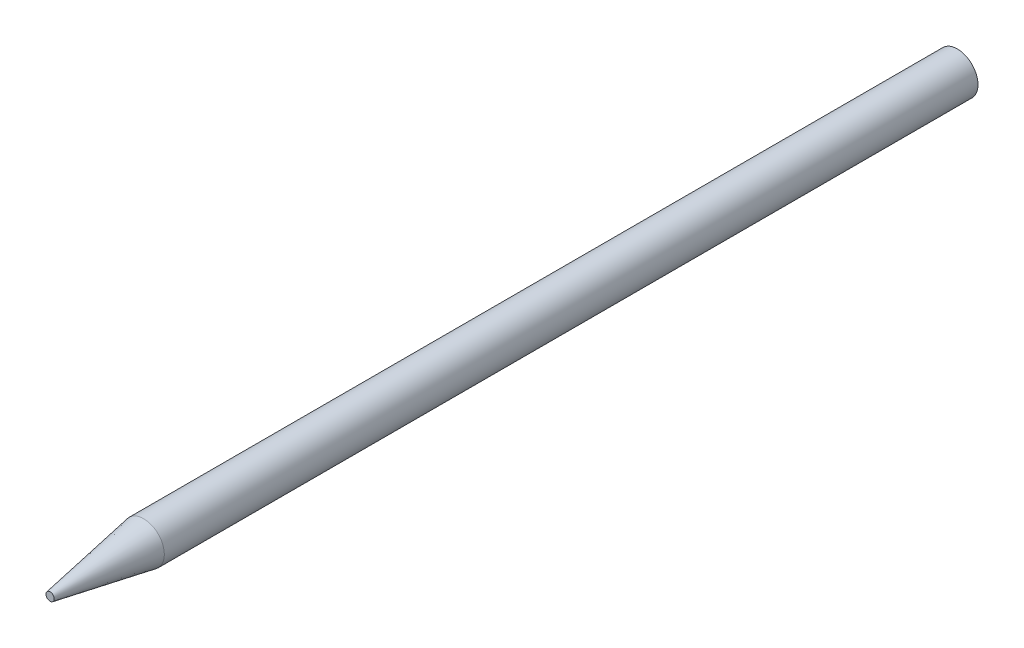
ISO-10303-21;
HEADER;
FILE_DESCRIPTION(('STEP AP214'),'2;1');
FILE_NAME('part.step','',(''),(''),'','','');
FILE_SCHEMA(('AUTOMOTIVE_DESIGN { 1 0 10303 214 1 1 1 1 }'));
ENDSEC;
DATA;
#1=APPLICATION_CONTEXT('core data for automotive mechanical design processes');
#2=APPLICATION_PROTOCOL_DEFINITION('international standard','automotive_design',2000,#1);
#3=PRODUCT_CONTEXT('',#1,'mechanical');
#4=PRODUCT('Part','Part','',(#3));
#5=PRODUCT_RELATED_PRODUCT_CATEGORY('part','',(#4));
#6=PRODUCT_DEFINITION_FORMATION('','',#4);
#7=PRODUCT_DEFINITION_CONTEXT('part definition',#1,'design');
#8=PRODUCT_DEFINITION('design','',#6,#7);
#9=PRODUCT_DEFINITION_SHAPE('','',#8);
#10=(LENGTH_UNIT() NAMED_UNIT(*) SI_UNIT(.MILLI.,.METRE.));
#11=(NAMED_UNIT(*) PLANE_ANGLE_UNIT() SI_UNIT($,.RADIAN.));
#12=(NAMED_UNIT(*) SI_UNIT($,.STERADIAN.) SOLID_ANGLE_UNIT());
#13=UNCERTAINTY_MEASURE_WITH_UNIT(LENGTH_MEASURE(1.E-05),#10,'distance_accuracy_value','');
#14=(GEOMETRIC_REPRESENTATION_CONTEXT(3) GLOBAL_UNCERTAINTY_ASSIGNED_CONTEXT((#13)) GLOBAL_UNIT_ASSIGNED_CONTEXT((#10,
#11,#12)) REPRESENTATION_CONTEXT('',''));
#15=CARTESIAN_POINT('',(0.,0.,0.));
#16=DIRECTION('',(0.,0.,1.));
#17=DIRECTION('',(1.,0.,0.));
#18=AXIS2_PLACEMENT_3D('',#15,#16,#17);
#19=CARTESIAN_POINT('',(0.,0.,110.));
#20=DIRECTION('',(0.,0.,-1.));
#21=DIRECTION('',(-1.,0.,0.));
#22=AXIS2_PLACEMENT_3D('',#19,#20,#21);
#23=CYLINDRICAL_SURFACE('',#22,2.5);
#24=CARTESIAN_POINT('',(0.,0.,98.6574363607651));
#25=DIRECTION('',(0.,0.,1.));
#26=DIRECTION('',(1.,0.,0.));
#27=AXIS2_PLACEMENT_3D('',#24,#25,#26);
#28=CIRCLE('',#27,2.5);
#29=CARTESIAN_POINT('',(-2.5,0.,98.6574363607651));
#30=VERTEX_POINT('',#29);
#31=EDGE_CURVE('E10',#30,#30,#28,.F.);
#32=ORIENTED_EDGE('',*,*,#31,.T.);
#33=EDGE_LOOP('',(#32));
#34=FACE_BOUND('',#33,.T.);
#35=CARTESIAN_POINT('',(0.,0.,0.));
#36=DIRECTION('',(0.,0.,1.));
#37=DIRECTION('',(1.,0.,0.));
#38=AXIS2_PLACEMENT_3D('',#35,#36,#37);
#39=CIRCLE('',#38,2.5);
#40=CARTESIAN_POINT('',(2.5,0.,0.));
#41=VERTEX_POINT('',#40);
#42=EDGE_CURVE('E53',#41,#41,#39,.T.);
#43=ORIENTED_EDGE('',*,*,#42,.T.);
#44=EDGE_LOOP('',(#43));
#45=FACE_BOUND('',#44,.T.);
#46=ADVANCED_FACE('F39',(#34,#45),#23,.T.);
#47=CARTESIAN_POINT('',(0.,0.,110.));
#48=DIRECTION('',(0.,0.,1.));
#49=DIRECTION('',(1.,0.,0.));
#50=AXIS2_PLACEMENT_3D('',#47,#48,#49);
#51=PLANE('',#50);
#52=CARTESIAN_POINT('',(0.,0.,110.));
#53=DIRECTION('',(0.,0.,1.));
#54=DIRECTION('',(1.,0.,0.));
#55=AXIS2_PLACEMENT_3D('',#52,#53,#54);
#56=CIRCLE('',#55,0.500000000000039);
#57=CARTESIAN_POINT('',(-0.50000000000004,0.,110.));
#58=VERTEX_POINT('',#57);
#59=EDGE_CURVE('E48',#58,#58,#56,.T.);
#60=ORIENTED_EDGE('',*,*,#59,.T.);
#61=EDGE_LOOP('',(#60));
#62=FACE_BOUND('',#61,.T.);
#63=ADVANCED_FACE('F64',(#62),#51,.T.);
#64=CARTESIAN_POINT('',(0.,0.,0.));
#65=DIRECTION('',(0.,0.,1.));
#66=DIRECTION('',(1.,0.,0.));
#67=AXIS2_PLACEMENT_3D('',#64,#65,#66);
#68=PLANE('',#67);
#69=ORIENTED_EDGE('',*,*,#42,.F.);
#70=EDGE_LOOP('',(#69));
#71=FACE_BOUND('',#70,.T.);
#72=ADVANCED_FACE('F62',(#71),#68,.F.);
#73=CARTESIAN_POINT('',(0.,0.,110.));
#74=DIRECTION('',(0.,0.,-1.));
#75=DIRECTION('',(-1.,0.,0.));
#76=AXIS2_PLACEMENT_3D('',#73,#74,#75);
#77=CONICAL_SURFACE('',#76,0.500000000000039,0.174532925199437);
#78=CARTESIAN_POINT('',(-2.5,0.,98.6574363607651));
#79=CARTESIAN_POINT('',(-2.47916666666667,0.,98.7755880653404));
#80=CARTESIAN_POINT('',(-2.45833333333334,0.,98.8937397699158));
#81=CARTESIAN_POINT('',(-2.41666666666667,0.,99.1300431790665));
#82=CARTESIAN_POINT('',(-2.39583333333334,0.,99.2481948836419));
#83=CARTESIAN_POINT('',(-2.35416666666667,0.,99.4844982927926));
#84=CARTESIAN_POINT('',(-2.33333333333334,0.,99.602649997368));
#85=CARTESIAN_POINT('',(-2.29166666666667,0.,99.8389534065187));
#86=CARTESIAN_POINT('',(-2.27083333333334,0.,99.9571051110941));
#87=CARTESIAN_POINT('',(-2.22916666666667,0.,100.193408520245));
#88=CARTESIAN_POINT('',(-2.20833333333334,0.,100.31156022482));
#89=CARTESIAN_POINT('',(-2.16666666666667,0.,100.547863633971));
#90=CARTESIAN_POINT('',(-2.14583333333334,0.,100.666015338546));
#91=CARTESIAN_POINT('',(-2.10416666666668,0.,100.902318747697));
#92=CARTESIAN_POINT('',(-2.08333333333334,0.,101.020470452272));
#93=CARTESIAN_POINT('',(-2.04166666666668,0.,101.256773861423));
#94=CARTESIAN_POINT('',(-2.02083333333334,0.,101.374925565998));
#95=CARTESIAN_POINT('',(-1.97916666666668,0.,101.611228975149));
#96=CARTESIAN_POINT('',(-1.95833333333335,0.,101.729380679725));
#97=CARTESIAN_POINT('',(-1.91666666666668,0.,101.965684088875));
#98=CARTESIAN_POINT('',(-1.89583333333335,0.,102.083835793451));
#99=CARTESIAN_POINT('',(-1.85416666666668,0.,102.320139202601));
#100=CARTESIAN_POINT('',(-1.83333333333335,0.,102.438290907177));
#101=CARTESIAN_POINT('',(-1.79166666666668,0.,102.674594316327));
#102=CARTESIAN_POINT('',(-1.77083333333335,0.,102.792746020903));
#103=CARTESIAN_POINT('',(-1.72916666666668,0.,103.029049430054));
#104=CARTESIAN_POINT('',(-1.70833333333335,0.,103.147201134629));
#105=CARTESIAN_POINT('',(-1.66666666666668,0.,103.38350454378));
#106=CARTESIAN_POINT('',(-1.64583333333335,0.,103.501656248355));
#107=CARTESIAN_POINT('',(-1.60416666666668,0.,103.737959657506));
#108=CARTESIAN_POINT('',(-1.58333333333335,0.,103.856111362081));
#109=CARTESIAN_POINT('',(-1.54166666666669,0.,104.092414771232));
#110=CARTESIAN_POINT('',(-1.52083333333335,0.,104.210566475807));
#111=CARTESIAN_POINT('',(-1.47916666666669,0.,104.446869884958));
#112=CARTESIAN_POINT('',(-1.45833333333335,0.,104.565021589533));
#113=CARTESIAN_POINT('',(-1.41666666666669,0.,104.801324998684));
#114=CARTESIAN_POINT('',(-1.39583333333336,0.,104.919476703259));
#115=CARTESIAN_POINT('',(-1.35416666666669,0.,105.15578011241));
#116=CARTESIAN_POINT('',(-1.33333333333336,0.,105.273931816985));
#117=CARTESIAN_POINT('',(-1.29166666666669,0.,105.510235226136));
#118=CARTESIAN_POINT('',(-1.27083333333336,0.,105.628386930712));
#119=CARTESIAN_POINT('',(-1.22916666666669,0.,105.864690339862));
#120=CARTESIAN_POINT('',(-1.20833333333336,0.,105.982842044438));
#121=CARTESIAN_POINT('',(-1.16666666666669,0.,106.219145453588));
#122=CARTESIAN_POINT('',(-1.14583333333336,0.,106.337297158164));
#123=CARTESIAN_POINT('',(-1.1041666666667,0.,106.573600567314));
#124=CARTESIAN_POINT('',(-1.08333333333336,0.,106.69175227189));
#125=CARTESIAN_POINT('',(-1.0416666666667,0.,106.928055681041));
#126=CARTESIAN_POINT('',(-1.02083333333336,0.,107.046207385616));
#127=CARTESIAN_POINT('',(-0.979166666666697,0.,107.282510794767));
#128=CARTESIAN_POINT('',(-0.958333333333364,0.,107.400662499342));
#129=CARTESIAN_POINT('',(-0.916666666666698,0.,107.636965908493));
#130=CARTESIAN_POINT('',(-0.895833333333366,0.,107.755117613068));
#131=CARTESIAN_POINT('',(-0.8541666666667,0.,107.991421022219));
#132=CARTESIAN_POINT('',(-0.833333333333367,0.,108.109572726794));
#133=CARTESIAN_POINT('',(-0.7916666666667,0.,108.345876135945));
#134=CARTESIAN_POINT('',(-0.770833333333367,0.,108.46402784052));
#135=CARTESIAN_POINT('',(-0.729166666666702,0.,108.700331249671));
#136=CARTESIAN_POINT('',(-0.70833333333337,0.,108.818482954246));
#137=CARTESIAN_POINT('',(-0.666666666666704,0.,109.054786363397));
#138=CARTESIAN_POINT('',(-0.64583333333337,0.,109.172938067972));
#139=CARTESIAN_POINT('',(-0.604166666666704,0.,109.409241477123));
#140=CARTESIAN_POINT('',(-0.583333333333371,0.,109.527393181699));
#141=CARTESIAN_POINT('',(-0.541666666666706,0.,109.763696590849));
#142=CARTESIAN_POINT('',(-0.520833333333373,0.,109.881848295425));
#143=CARTESIAN_POINT('',(-0.50000000000004,0.,110.));
#144=B_SPLINE_CURVE_WITH_KNOTS('',3,(#78,#79,#80,#81,#82,#83,#84,#85,#86,#87,#88,#89,#90,#91,
#92,#93,#94,#95,#96,#97,#98,#99,#100,#101,#102,#103,#104,#105,#106,#107,#108,#109,#110,#111,
#112,#113,#114,#115,#116,#117,#118,#119,#120,#121,#122,#123,#124,#125,#126,#127,#128,#129,#130,
#131,#132,#133,#134,#135,#136,#137,#138,#139,#140,#141,#142,#143),.UNSPECIFIED.,.F.,.F.,(4,2,2,
2,2,2,2,2,2,2,2,2,2,2,2,2,2,2,2,2,2,2,2,2,2,2,2,2,2,2,2,2,4),(0.,0.359923155196458,
0.719846310392916,1.07976946558937,1.43969262078585,1.7996157759823,2.15953893117876,
2.51946208637523,2.87938524157169,3.23930839676815,3.59923155196461,3.95915470716108,
4.31907786235754,4.679001017554,5.03892417275045,5.39884732794692,5.75877048314338,
6.11869363833984,6.47861679353631,6.83853994873277,7.19846310392923,7.55838625912569,
7.91830941432216,8.27823256951862,8.63815572471507,8.99807887991153,9.358002035108,
9.71792519030446,10.0778483455009,10.4377715006974,10.7976946558938,11.1576178110903,
11.5175409662868),.UNSPECIFIED.);
#145=EDGE_CURVE('BSEAM42',#30,#58,#144,.T.);
#146=ORIENTED_EDGE('',*,*,#31,.F.);
#147=ORIENTED_EDGE('',*,*,#59,.F.);
#148=ORIENTED_EDGE('',*,*,#145,.T.);
#149=ORIENTED_EDGE('',*,*,#145,.F.);
#150=EDGE_LOOP('',(#146,#148,#147,#149));
#151=FACE_BOUND('',#150,.T.);
#152=ADVANCED_FACE('F42',(#151),#77,.T.);
#153=CLOSED_SHELL('',(#46,#63,#72,#152));
#154=MANIFOLD_SOLID_BREP('B2',#153);
#155=ADVANCED_BREP_SHAPE_REPRESENTATION('',(#18,#154),#14);
#156=SHAPE_DEFINITION_REPRESENTATION(#9,#155);
ENDSEC;
END-ISO-10303-21;
